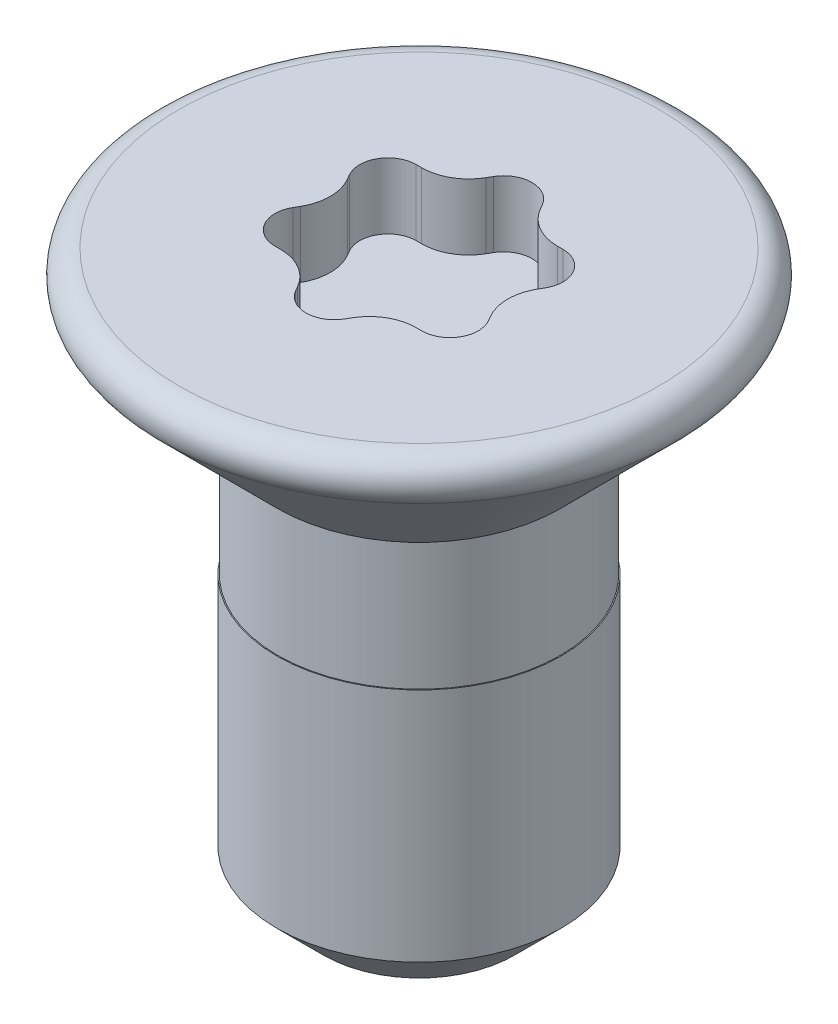
ISO-10303-21;
HEADER;
FILE_DESCRIPTION(('STEP AP214'),'2;1');
FILE_NAME('part.step','',(''),(''),'','','');
FILE_SCHEMA(('AUTOMOTIVE_DESIGN { 1 0 10303 214 1 1 1 1 }'));
ENDSEC;
DATA;
#1=APPLICATION_CONTEXT('core data for automotive mechanical design processes');
#2=APPLICATION_PROTOCOL_DEFINITION('international standard','automotive_design',2000,#1);
#3=PRODUCT_CONTEXT('',#1,'mechanical');
#4=PRODUCT('Part','Part','',(#3));
#5=PRODUCT_RELATED_PRODUCT_CATEGORY('part','',(#4));
#6=PRODUCT_DEFINITION_FORMATION('','',#4);
#7=PRODUCT_DEFINITION_CONTEXT('part definition',#1,'design');
#8=PRODUCT_DEFINITION('design','',#6,#7);
#9=PRODUCT_DEFINITION_SHAPE('','',#8);
#10=(LENGTH_UNIT() NAMED_UNIT(*) SI_UNIT(.MILLI.,.METRE.));
#11=(NAMED_UNIT(*) PLANE_ANGLE_UNIT() SI_UNIT($,.RADIAN.));
#12=(NAMED_UNIT(*) SI_UNIT($,.STERADIAN.) SOLID_ANGLE_UNIT());
#13=UNCERTAINTY_MEASURE_WITH_UNIT(LENGTH_MEASURE(1.E-05),#10,'distance_accuracy_value','');
#14=(GEOMETRIC_REPRESENTATION_CONTEXT(3) GLOBAL_UNCERTAINTY_ASSIGNED_CONTEXT((#13)) GLOBAL_UNIT_ASSIGNED_CONTEXT((#10,
#11,#12)) REPRESENTATION_CONTEXT('',''));
#15=CARTESIAN_POINT('',(0.,0.,0.));
#16=DIRECTION('',(0.,0.,1.));
#17=DIRECTION('',(1.,0.,0.));
#18=AXIS2_PLACEMENT_3D('',#15,#16,#17);
#19=CARTESIAN_POINT('',(0.,-6.,0.));
#20=DIRECTION('',(0.,-1.,0.));
#21=DIRECTION('',(1.,0.,0.));
#22=AXIS2_PLACEMENT_3D('',#19,#20,#21);
#23=PLANE('',#22);
#24=CARTESIAN_POINT('',(0.,-6.00000000008549,0.));
#25=DIRECTION('',(0.,1.,0.));
#26=DIRECTION('',(0.,0.,1.));
#27=AXIS2_PLACEMENT_3D('',#24,#25,#26);
#28=CIRCLE('',#27,1.01414213560247);
#29=CARTESIAN_POINT('',(0.,-6.00000000008549,1.01414213560247));
#30=VERTEX_POINT('',#29);
#31=EDGE_CURVE('E285',#30,#30,#28,.T.);
#32=ORIENTED_EDGE('',*,*,#31,.F.);
#33=EDGE_LOOP('',(#32));
#34=FACE_BOUND('',#33,.T.);
#35=ADVANCED_FACE('F17',(#34),#23,.T.);
#36=CARTESIAN_POINT('',(0.,-5.50414213569184,0.));
#37=DIRECTION('',(0.,1.,0.));
#38=DIRECTION('',(0.,0.,1.));
#39=AXIS2_PLACEMENT_3D('',#36,#37,#38);
#40=CONICAL_SURFACE('',#39,1.50999999999613,0.785398163397448);
#41=ORIENTED_EDGE('',*,*,#31,.T.);
#42=EDGE_LOOP('',(#41));
#43=FACE_BOUND('',#42,.T.);
#44=CARTESIAN_POINT('',(0.,-5.50414213562373,0.));
#45=DIRECTION('',(0.,1.,0.));
#46=DIRECTION('',(0.,0.,1.));
#47=AXIS2_PLACEMENT_3D('',#44,#45,#46);
#48=CIRCLE('',#47,1.51);
#49=CARTESIAN_POINT('',(0.,-5.50414213562373,1.51));
#50=VERTEX_POINT('',#49);
#51=EDGE_CURVE('E282',#50,#50,#48,.T.);
#52=ORIENTED_EDGE('',*,*,#51,.F.);
#53=EDGE_LOOP('',(#52));
#54=FACE_BOUND('',#53,.T.);
#55=ADVANCED_FACE('F747',(#43,#54),#40,.T.);
#56=CARTESIAN_POINT('',(0.,0.,0.));
#57=DIRECTION('',(0.,1.,0.));
#58=DIRECTION('',(0.,0.,1.));
#59=AXIS2_PLACEMENT_3D('',#56,#57,#58);
#60=CYLINDRICAL_SURFACE('',#59,1.51);
#61=ORIENTED_EDGE('',*,*,#51,.T.);
#62=EDGE_LOOP('',(#61));
#63=FACE_BOUND('',#62,.T.);
#64=CARTESIAN_POINT('',(0.,-3.,0.));
#65=DIRECTION('',(0.,1.,0.));
#66=DIRECTION('',(0.,0.,1.));
#67=AXIS2_PLACEMENT_3D('',#64,#65,#66);
#68=CIRCLE('',#67,1.51);
#69=CARTESIAN_POINT('',(0.,-3.,1.51));
#70=VERTEX_POINT('',#69);
#71=EDGE_CURVE('E284',#70,#70,#68,.T.);
#72=ORIENTED_EDGE('',*,*,#71,.F.);
#73=EDGE_LOOP('',(#72));
#74=FACE_BOUND('',#73,.T.);
#75=ADVANCED_FACE('F737',(#63,#74),#60,.T.);
#76=CARTESIAN_POINT('',(-1.5,-3.,0.));
#77=DIRECTION('',(0.,1.,0.));
#78=DIRECTION('',(0.,0.,1.));
#79=AXIS2_PLACEMENT_3D('',#76,#77,#78);
#80=PLANE('',#79);
#81=CARTESIAN_POINT('',(0.,-3.,0.));
#82=DIRECTION('',(0.,1.,0.));
#83=DIRECTION('',(-1.,0.,0.));
#84=AXIS2_PLACEMENT_3D('',#81,#82,#83);
#85=CIRCLE('',#84,1.5);
#86=CARTESIAN_POINT('',(-1.5,-3.,0.));
#87=VERTEX_POINT('',#86);
#88=EDGE_CURVE('E281',#87,#87,#85,.T.);
#89=ORIENTED_EDGE('',*,*,#88,.F.);
#90=EDGE_LOOP('',(#89));
#91=FACE_BOUND('',#90,.T.);
#92=ORIENTED_EDGE('',*,*,#71,.T.);
#93=EDGE_LOOP('',(#92));
#94=FACE_BOUND('',#93,.T.);
#95=ADVANCED_FACE('F727',(#91,#94),#80,.T.);
#96=CARTESIAN_POINT('',(0.,-1.65,0.));
#97=DIRECTION('',(0.,1.,0.));
#98=DIRECTION('',(-1.,0.,0.));
#99=AXIS2_PLACEMENT_3D('',#96,#97,#98);
#100=CYLINDRICAL_SURFACE('',#99,1.5);
#101=CARTESIAN_POINT('',(0.,-1.65000000004056,0.));
#102=DIRECTION('',(0.,1.,0.));
#103=DIRECTION('',(0.,0.,1.));
#104=AXIS2_PLACEMENT_3D('',#101,#102,#103);
#105=CIRCLE('',#104,1.49999999996453);
#106=CARTESIAN_POINT('',(0.,-1.65000000004056,1.49999999996453));
#107=VERTEX_POINT('',#106);
#108=EDGE_CURVE('E278',#107,#107,#105,.T.);
#109=ORIENTED_EDGE('',*,*,#108,.F.);
#110=EDGE_LOOP('',(#109));
#111=FACE_BOUND('',#110,.T.);
#112=ORIENTED_EDGE('',*,*,#88,.T.);
#113=EDGE_LOOP('',(#112));
#114=FACE_BOUND('',#113,.T.);
#115=ADVANCED_FACE('F719',(#111,#114),#100,.T.);
#116=CARTESIAN_POINT('',(0.,-0.426776695405806,0.));
#117=DIRECTION('',(0.,1.,0.));
#118=DIRECTION('',(-1.,0.,0.));
#119=AXIS2_PLACEMENT_3D('',#116,#117,#118);
#120=CONICAL_SURFACE('',#119,2.72322330459929,0.785398163397448);
#121=ORIENTED_EDGE('',*,*,#108,.T.);
#122=EDGE_LOOP('',(#121));
#123=FACE_BOUND('',#122,.T.);
#124=CARTESIAN_POINT('',(0.,-0.426776695296636,0.));
#125=DIRECTION('',(0.,-1.,0.));
#126=DIRECTION('',(0.,0.,-1.));
#127=AXIS2_PLACEMENT_3D('',#124,#125,#126);
#128=CIRCLE('',#127,2.72322330470336);
#129=CARTESIAN_POINT('',(0.,-0.426776695296636,-2.72322330470336));
#130=VERTEX_POINT('',#129);
#131=EDGE_CURVE('E240',#130,#130,#128,.F.);
#132=ORIENTED_EDGE('',*,*,#131,.F.);
#133=EDGE_LOOP('',(#132));
#134=FACE_BOUND('',#133,.T.);
#135=ADVANCED_FACE('F712',(#123,#134),#120,.T.);
#136=CARTESIAN_POINT('',(-0.721687836487033,-0.7,-1.25));
#137=DIRECTION('',(0.,1.,0.));
#138=DIRECTION('',(0.,0.,1.));
#139=AXIS2_PLACEMENT_3D('',#136,#137,#138);
#140=PLANE('',#139);
#141=CARTESIAN_POINT('',(0.,-0.7,-0.900000000000001));
#142=DIRECTION('',(0.,1.,0.));
#143=DIRECTION('',(0.,0.,1.));
#144=AXIS2_PLACEMENT_3D('',#141,#142,#143);
#145=CIRCLE('',#144,0.3);
#146=CARTESIAN_POINT('',(0.259807621135331,-0.7,-1.05));
#147=VERTEX_POINT('',#146);
#148=CARTESIAN_POINT('',(-0.259807621135332,-0.7,-1.05));
#149=VERTEX_POINT('',#148);
#150=EDGE_CURVE('E238',#147,#149,#145,.T.);
#151=ORIENTED_EDGE('',*,*,#150,.T.);
#152=DIRECTION('',(0.5,0.,-0.866025403784438));
#153=VECTOR('',#152,1.);
#154=CARTESIAN_POINT('',(-0.288675134594814,-0.7,-1.));
#155=LINE('',#154,#153);
#156=CARTESIAN_POINT('',(-0.288675134594814,-0.7,-1.));
#157=VERTEX_POINT('',#156);
#158=EDGE_CURVE('E230',#157,#149,#155,.T.);
#159=ORIENTED_EDGE('',*,*,#158,.F.);
#160=CARTESIAN_POINT('',(-0.721687836487033,-0.7,-1.25));
#161=DIRECTION('',(0.,1.,0.));
#162=DIRECTION('',(0.,0.,1.));
#163=AXIS2_PLACEMENT_3D('',#160,#161,#162);
#164=CIRCLE('',#163,0.5);
#165=CARTESIAN_POINT('',(-0.721687836487033,-0.7,-0.75));
#166=VERTEX_POINT('',#165);
#167=EDGE_CURVE('E328',#166,#157,#164,.T.);
#168=ORIENTED_EDGE('',*,*,#167,.F.);
#169=DIRECTION('',(1.,0.,0.));
#170=VECTOR('',#169,1.);
#171=CARTESIAN_POINT('',(-0.779422863405995,-0.7,-0.75));
#172=LINE('',#171,#170);
#173=CARTESIAN_POINT('',(-0.779422863405995,-0.7,-0.75));
#174=VERTEX_POINT('',#173);
#175=EDGE_CURVE('E180',#174,#166,#172,.T.);
#176=ORIENTED_EDGE('',*,*,#175,.F.);
#177=CARTESIAN_POINT('',(-0.779422863405995,-0.7,-0.45));
#178=DIRECTION('',(0.,1.,0.));
#179=DIRECTION('',(0.,0.,1.));
#180=AXIS2_PLACEMENT_3D('',#177,#178,#179);
#181=CIRCLE('',#180,0.3);
#182=CARTESIAN_POINT('',(-1.03923048454133,-0.7,-0.3));
#183=VERTEX_POINT('',#182);
#184=EDGE_CURVE('E194',#174,#183,#181,.T.);
#185=ORIENTED_EDGE('',*,*,#184,.T.);
#186=DIRECTION('',(-0.500000000000001,0.,-0.866025403784438));
#187=VECTOR('',#186,1.);
#188=CARTESIAN_POINT('',(-1.01036297108185,-0.7,-0.25));
#189=LINE('',#188,#187);
#190=CARTESIAN_POINT('',(-1.01036297108185,-0.7,-0.25));
#191=VERTEX_POINT('',#190);
#192=EDGE_CURVE('E186',#191,#183,#189,.T.);
#193=ORIENTED_EDGE('',*,*,#192,.F.);
#194=CARTESIAN_POINT('',(-1.44337567297407,-0.7,0.));
#195=DIRECTION('',(0.,1.,0.));
#196=DIRECTION('',(0.,0.,1.));
#197=AXIS2_PLACEMENT_3D('',#194,#195,#196);
#198=CIRCLE('',#197,0.5);
#199=CARTESIAN_POINT('',(-1.01036297108185,-0.7,0.249999999999999));
#200=VERTEX_POINT('',#199);
#201=EDGE_CURVE('E206',#200,#191,#198,.T.);
#202=ORIENTED_EDGE('',*,*,#201,.F.);
#203=DIRECTION('',(0.499999999999995,0.,-0.866025403784441));
#204=VECTOR('',#203,1.);
#205=CARTESIAN_POINT('',(-1.03923048454133,-0.7,0.300000000000001));
#206=LINE('',#205,#204);
#207=CARTESIAN_POINT('',(-1.03923048454133,-0.7,0.300000000000001));
#208=VERTEX_POINT('',#207);
#209=EDGE_CURVE('E273',#208,#200,#206,.T.);
#210=ORIENTED_EDGE('',*,*,#209,.F.);
#211=CARTESIAN_POINT('',(-0.779422863405996,-0.7,0.450000000000001));
#212=DIRECTION('',(0.,1.,0.));
#213=DIRECTION('',(0.,0.,1.));
#214=AXIS2_PLACEMENT_3D('',#211,#212,#213);
#215=CIRCLE('',#214,0.3);
#216=CARTESIAN_POINT('',(-0.779422863405997,-0.7,0.75));
#217=VERTEX_POINT('',#216);
#218=EDGE_CURVE('E272',#208,#217,#215,.T.);
#219=ORIENTED_EDGE('',*,*,#218,.T.);
#220=DIRECTION('',(-1.,0.,0.));
#221=VECTOR('',#220,1.);
#222=CARTESIAN_POINT('',(-0.721687836487033,-0.7,0.750000000000001));
#223=LINE('',#222,#221);
#224=CARTESIAN_POINT('',(-0.721687836487031,-0.7,0.750000000000001));
#225=VERTEX_POINT('',#224);
#226=EDGE_CURVE('E269',#225,#217,#223,.T.);
#227=ORIENTED_EDGE('',*,*,#226,.F.);
#228=CARTESIAN_POINT('',(-0.721687836487033,-0.7,1.25));
#229=DIRECTION('',(0.,1.,0.));
#230=DIRECTION('',(0.,0.,1.));
#231=AXIS2_PLACEMENT_3D('',#228,#229,#230);
#232=CIRCLE('',#231,0.5);
#233=CARTESIAN_POINT('',(-0.288675134594814,-0.7,1.));
#234=VERTEX_POINT('',#233);
#235=EDGE_CURVE('E348',#234,#225,#232,.T.);
#236=ORIENTED_EDGE('',*,*,#235,.F.);
#237=DIRECTION('',(-0.500000000000002,0.,-0.866025403784438));
#238=VECTOR('',#237,1.);
#239=CARTESIAN_POINT('',(-0.259807621135332,-0.7,1.05));
#240=LINE('',#239,#238);
#241=CARTESIAN_POINT('',(-0.259807621135331,-0.7,1.05));
#242=VERTEX_POINT('',#241);
#243=EDGE_CURVE('E265',#242,#234,#240,.T.);
#244=ORIENTED_EDGE('',*,*,#243,.F.);
#245=CARTESIAN_POINT('',(0.,-0.7,0.900000000000001));
#246=DIRECTION('',(0.,1.,0.));
#247=DIRECTION('',(0.,0.,1.));
#248=AXIS2_PLACEMENT_3D('',#245,#246,#247);
#249=CIRCLE('',#248,0.3);
#250=CARTESIAN_POINT('',(0.259807621135332,-0.7,1.05));
#251=VERTEX_POINT('',#250);
#252=EDGE_CURVE('E264',#242,#251,#249,.T.);
#253=ORIENTED_EDGE('',*,*,#252,.T.);
#254=DIRECTION('',(-0.499999999999999,0.,0.866025403784439));
#255=VECTOR('',#254,1.);
#256=CARTESIAN_POINT('',(0.288675134594813,-0.7,1.));
#257=LINE('',#256,#255);
#258=CARTESIAN_POINT('',(0.288675134594813,-0.7,1.));
#259=VERTEX_POINT('',#258);
#260=EDGE_CURVE('E261',#259,#251,#257,.T.);
#261=ORIENTED_EDGE('',*,*,#260,.F.);
#262=CARTESIAN_POINT('',(0.721687836487033,-0.7,1.25));
#263=DIRECTION('',(0.,1.,0.));
#264=DIRECTION('',(0.,0.,1.));
#265=AXIS2_PLACEMENT_3D('',#262,#263,#264);
#266=CIRCLE('',#265,0.5);
#267=CARTESIAN_POINT('',(0.721687836487032,-0.7,0.750000000000001));
#268=VERTEX_POINT('',#267);
#269=EDGE_CURVE('E343',#268,#259,#266,.T.);
#270=ORIENTED_EDGE('',*,*,#269,.F.);
#271=DIRECTION('',(-1.,0.,0.));
#272=VECTOR('',#271,1.);
#273=CARTESIAN_POINT('',(0.779422863405995,-0.7,0.750000000000001));
#274=LINE('',#273,#272);
#275=CARTESIAN_POINT('',(0.779422863405995,-0.7,0.750000000000001));
#276=VERTEX_POINT('',#275);
#277=EDGE_CURVE('E257',#276,#268,#274,.T.);
#278=ORIENTED_EDGE('',*,*,#277,.F.);
#279=CARTESIAN_POINT('',(0.779422863405995,-0.7,0.450000000000001));
#280=DIRECTION('',(0.,1.,0.));
#281=DIRECTION('',(0.,0.,1.));
#282=AXIS2_PLACEMENT_3D('',#279,#280,#281);
#283=CIRCLE('',#282,0.3);
#284=CARTESIAN_POINT('',(1.03923048454133,-0.7,0.300000000000001));
#285=VERTEX_POINT('',#284);
#286=EDGE_CURVE('E256',#276,#285,#283,.T.);
#287=ORIENTED_EDGE('',*,*,#286,.T.);
#288=DIRECTION('',(0.499999999999997,0.,0.866025403784441));
#289=VECTOR('',#288,1.);
#290=CARTESIAN_POINT('',(1.01036297108185,-0.7,0.250000000000001));
#291=LINE('',#290,#289);
#292=CARTESIAN_POINT('',(1.01036297108185,-0.7,0.25));
#293=VERTEX_POINT('',#292);
#294=EDGE_CURVE('E253',#293,#285,#291,.T.);
#295=ORIENTED_EDGE('',*,*,#294,.F.);
#296=CARTESIAN_POINT('',(1.44337567297406,-0.7,0.));
#297=DIRECTION('',(0.,1.,0.));
#298=DIRECTION('',(0.,0.,1.));
#299=AXIS2_PLACEMENT_3D('',#296,#297,#298);
#300=CIRCLE('',#299,0.5);
#301=CARTESIAN_POINT('',(1.01036297108185,-0.7,-0.25));
#302=VERTEX_POINT('',#301);
#303=EDGE_CURVE('E338',#302,#293,#300,.T.);
#304=ORIENTED_EDGE('',*,*,#303,.F.);
#305=DIRECTION('',(-0.500000000000003,0.,0.866025403784437));
#306=VECTOR('',#305,1.);
#307=CARTESIAN_POINT('',(1.03923048454133,-0.7,-0.3));
#308=LINE('',#307,#306);
#309=CARTESIAN_POINT('',(1.03923048454133,-0.7,-0.299999999999999));
#310=VERTEX_POINT('',#309);
#311=EDGE_CURVE('E249',#310,#302,#308,.T.);
#312=ORIENTED_EDGE('',*,*,#311,.F.);
#313=CARTESIAN_POINT('',(0.779422863405996,-0.7,-0.45));
#314=DIRECTION('',(0.,1.,0.));
#315=DIRECTION('',(0.,0.,1.));
#316=AXIS2_PLACEMENT_3D('',#313,#314,#315);
#317=CIRCLE('',#316,0.3);
#318=CARTESIAN_POINT('',(0.779422863405996,-0.7,-0.749999999999999));
#319=VERTEX_POINT('',#318);
#320=EDGE_CURVE('E248',#310,#319,#317,.T.);
#321=ORIENTED_EDGE('',*,*,#320,.T.);
#322=DIRECTION('',(1.,0.,0.));
#323=VECTOR('',#322,1.);
#324=CARTESIAN_POINT('',(0.721687836487033,-0.7,-0.749999999999999));
#325=LINE('',#324,#323);
#326=CARTESIAN_POINT('',(0.721687836487033,-0.7,-0.75));
#327=VERTEX_POINT('',#326);
#328=EDGE_CURVE('E245',#327,#319,#325,.T.);
#329=ORIENTED_EDGE('',*,*,#328,.F.);
#330=CARTESIAN_POINT('',(0.721687836487033,-0.7,-1.25));
#331=DIRECTION('',(0.,1.,0.));
#332=DIRECTION('',(0.,0.,1.));
#333=AXIS2_PLACEMENT_3D('',#330,#331,#332);
#334=CIRCLE('',#333,0.5);
#335=CARTESIAN_POINT('',(0.288675134594814,-0.7,-0.999999999999999));
#336=VERTEX_POINT('',#335);
#337=EDGE_CURVE('E333',#336,#327,#334,.T.);
#338=ORIENTED_EDGE('',*,*,#337,.F.);
#339=DIRECTION('',(0.500000000000004,0.,0.866025403784436));
#340=VECTOR('',#339,1.);
#341=CARTESIAN_POINT('',(0.259807621135331,-0.7,-1.05));
#342=LINE('',#341,#340);
#343=EDGE_CURVE('E241',#147,#336,#342,.T.);
#344=ORIENTED_EDGE('',*,*,#343,.F.);
#345=EDGE_LOOP('',(#151,#159,#168,#176,#185,#193,#202,#210,#219,#227,#236,#244,#253,#261,#270,
#278,#287,#295,#304,#312,#321,#329,#338,#344));
#346=FACE_BOUND('',#345,.T.);
#347=ADVANCED_FACE('F197',(#346),#140,.T.);
#348=CARTESIAN_POINT('',(0.,-0.25,0.));
#349=DIRECTION('',(0.,-1.,0.));
#350=DIRECTION('',(0.,0.,-1.));
#351=AXIS2_PLACEMENT_3D('',#348,#349,#350);
#352=TOROIDAL_SURFACE('',#351,2.54644660940672,0.25);
#353=CARTESIAN_POINT('',(0.,0.,0.));
#354=DIRECTION('',(0.,-1.,0.));
#355=DIRECTION('',(0.,0.,-1.));
#356=AXIS2_PLACEMENT_3D('',#353,#354,#355);
#357=CIRCLE('',#356,2.54644660940672);
#358=CARTESIAN_POINT('',(0.,0.,-2.54644660940672));
#359=VERTEX_POINT('',#358);
#360=CARTESIAN_POINT('',(0.,0.,2.54644660940672));
#361=VERTEX_POINT('',#360);
#362=EDGE_CURVE('E360',#359,#361,#357,.T.);
#363=ORIENTED_EDGE('',*,*,#362,.T.);
#364=CARTESIAN_POINT('',(0.,0.,0.));
#365=DIRECTION('',(0.,-1.,0.));
#366=DIRECTION('',(0.,0.,1.));
#367=AXIS2_PLACEMENT_3D('',#364,#365,#366);
#368=CIRCLE('',#367,2.54644660940672);
#369=EDGE_CURVE('E363',#361,#359,#368,.T.);
#370=ORIENTED_EDGE('',*,*,#369,.T.);
#371=EDGE_LOOP('',(#363,#370));
#372=FACE_BOUND('',#371,.T.);
#373=ORIENTED_EDGE('',*,*,#131,.T.);
#374=EDGE_LOOP('',(#373));
#375=FACE_BOUND('',#374,.T.);
#376=ADVANCED_FACE('F217',(#372,#375),#352,.T.);
#377=CARTESIAN_POINT('',(-0.779422863405995,-0.7,-0.75));
#378=DIRECTION('',(0.,0.,1.));
#379=DIRECTION('',(1.,0.,0.));
#380=AXIS2_PLACEMENT_3D('',#377,#378,#379);
#381=PLANE('',#380);
#382=ORIENTED_EDGE('',*,*,#175,.T.);
#383=DIRECTION('',(0.,1.,0.));
#384=VECTOR('',#383,1.);
#385=CARTESIAN_POINT('',(-0.721687836487033,-0.7,-0.75));
#386=LINE('',#385,#384);
#387=CARTESIAN_POINT('',(-0.721687836487033,0.,-0.75));
#388=VERTEX_POINT('',#387);
#389=EDGE_CURVE('E330',#388,#166,#386,.F.);
#390=ORIENTED_EDGE('',*,*,#389,.F.);
#391=DIRECTION('',(1.,0.,0.));
#392=VECTOR('',#391,1.);
#393=CARTESIAN_POINT('',(0.,0.,-0.75));
#394=LINE('',#393,#392);
#395=CARTESIAN_POINT('',(-0.779422863405995,0.,-0.75));
#396=VERTEX_POINT('',#395);
#397=EDGE_CURVE('E327',#388,#396,#394,.F.);
#398=ORIENTED_EDGE('',*,*,#397,.T.);
#399=DIRECTION('',(0.,1.,0.));
#400=VECTOR('',#399,1.);
#401=CARTESIAN_POINT('',(-0.779422863405995,-0.7,-0.75));
#402=LINE('',#401,#400);
#403=EDGE_CURVE('E200',#396,#174,#402,.F.);
#404=ORIENTED_EDGE('',*,*,#403,.T.);
#405=EDGE_LOOP('',(#382,#390,#398,#404));
#406=FACE_BOUND('',#405,.T.);
#407=ADVANCED_FACE('F222',(#406),#381,.T.);
#408=CARTESIAN_POINT('',(-0.779422863405995,-0.7,-0.45));
#409=DIRECTION('',(0.,1.,0.));
#410=DIRECTION('',(0.,0.,1.));
#411=AXIS2_PLACEMENT_3D('',#408,#409,#410);
#412=CYLINDRICAL_SURFACE('',#411,0.3);
#413=DIRECTION('',(0.,1.,0.));
#414=VECTOR('',#413,1.);
#415=CARTESIAN_POINT('',(-1.03923048454133,-0.7,-0.3));
#416=LINE('',#415,#414);
#417=CARTESIAN_POINT('',(-1.03923048454133,0.,-0.3));
#418=VERTEX_POINT('',#417);
#419=EDGE_CURVE('E190',#183,#418,#416,.T.);
#420=ORIENTED_EDGE('',*,*,#419,.F.);
#421=ORIENTED_EDGE('',*,*,#184,.F.);
#422=ORIENTED_EDGE('',*,*,#403,.F.);
#423=CARTESIAN_POINT('',(-0.779422863405995,0.,-0.45));
#424=DIRECTION('',(0.,1.,0.));
#425=DIRECTION('',(0.,0.,1.));
#426=AXIS2_PLACEMENT_3D('',#423,#424,#425);
#427=CIRCLE('',#426,0.3);
#428=EDGE_CURVE('E205',#396,#418,#427,.T.);
#429=ORIENTED_EDGE('',*,*,#428,.T.);
#430=EDGE_LOOP('',(#420,#421,#422,#429));
#431=FACE_BOUND('',#430,.T.);
#432=ADVANCED_FACE('F203',(#431),#412,.F.);
#433=CARTESIAN_POINT('',(-1.01036297108185,-0.7,-0.25));
#434=DIRECTION('',(0.866025403784438,0.,-0.500000000000001));
#435=DIRECTION('',(-0.500000000000001,0.,-0.866025403784438));
#436=AXIS2_PLACEMENT_3D('',#433,#434,#435);
#437=PLANE('',#436);
#438=ORIENTED_EDGE('',*,*,#192,.T.);
#439=ORIENTED_EDGE('',*,*,#419,.T.);
#440=DIRECTION('',(0.499999999999999,0.,0.866025403784439));
#441=VECTOR('',#440,1.);
#442=CARTESIAN_POINT('',(-1.03923048454133,0.,-0.3));
#443=LINE('',#442,#441);
#444=CARTESIAN_POINT('',(-1.01036297108185,0.,-0.249999999999999));
#445=VERTEX_POINT('',#444);
#446=EDGE_CURVE('E325',#418,#445,#443,.T.);
#447=ORIENTED_EDGE('',*,*,#446,.T.);
#448=DIRECTION('',(0.,1.,0.));
#449=VECTOR('',#448,1.);
#450=CARTESIAN_POINT('',(-1.01036297108185,-0.7,-0.25));
#451=LINE('',#450,#449);
#452=EDGE_CURVE('E192',#191,#445,#451,.T.);
#453=ORIENTED_EDGE('',*,*,#452,.F.);
#454=EDGE_LOOP('',(#438,#439,#447,#453));
#455=FACE_BOUND('',#454,.T.);
#456=ADVANCED_FACE('F187',(#455),#437,.T.);
#457=CARTESIAN_POINT('',(-1.44337567297407,-0.7,0.));
#458=DIRECTION('',(0.,1.,0.));
#459=DIRECTION('',(0.,0.,1.));
#460=AXIS2_PLACEMENT_3D('',#457,#458,#459);
#461=CYLINDRICAL_SURFACE('',#460,0.5);
#462=ORIENTED_EDGE('',*,*,#201,.T.);
#463=ORIENTED_EDGE('',*,*,#452,.T.);
#464=CARTESIAN_POINT('',(-1.44337567297407,0.,0.));
#465=DIRECTION('',(0.,1.,0.));
#466=DIRECTION('',(0.,0.,1.));
#467=AXIS2_PLACEMENT_3D('',#464,#465,#466);
#468=CIRCLE('',#467,0.5);
#469=CARTESIAN_POINT('',(-1.01036297108185,0.,0.249999999999999));
#470=VERTEX_POINT('',#469);
#471=EDGE_CURVE('E322',#445,#470,#468,.F.);
#472=ORIENTED_EDGE('',*,*,#471,.T.);
#473=DIRECTION('',(0.,1.,0.));
#474=VECTOR('',#473,1.);
#475=CARTESIAN_POINT('',(-1.01036297108185,-0.7,0.25));
#476=LINE('',#475,#474);
#477=EDGE_CURVE('E274',#200,#470,#476,.T.);
#478=ORIENTED_EDGE('',*,*,#477,.F.);
#479=EDGE_LOOP('',(#462,#463,#472,#478));
#480=FACE_BOUND('',#479,.T.);
#481=ADVANCED_FACE('F408',(#480),#461,.T.);
#482=CARTESIAN_POINT('',(-1.03923048454133,-0.7,0.300000000000001));
#483=DIRECTION('',(0.866025403784441,0.,0.499999999999995));
#484=DIRECTION('',(0.499999999999995,0.,-0.866025403784441));
#485=AXIS2_PLACEMENT_3D('',#482,#483,#484);
#486=PLANE('',#485);
#487=ORIENTED_EDGE('',*,*,#209,.T.);
#488=ORIENTED_EDGE('',*,*,#477,.T.);
#489=DIRECTION('',(-0.499999999999995,0.,0.866025403784441));
#490=VECTOR('',#489,1.);
#491=CARTESIAN_POINT('',(-1.01036297108185,0.,0.25));
#492=LINE('',#491,#490);
#493=CARTESIAN_POINT('',(-1.03923048454133,0.,0.300000000000001));
#494=VERTEX_POINT('',#493);
#495=EDGE_CURVE('E321',#470,#494,#492,.T.);
#496=ORIENTED_EDGE('',*,*,#495,.T.);
#497=DIRECTION('',(0.,1.,0.));
#498=VECTOR('',#497,1.);
#499=CARTESIAN_POINT('',(-1.03923048454133,-0.7,0.300000000000001));
#500=LINE('',#499,#498);
#501=EDGE_CURVE('E351',#494,#208,#500,.F.);
#502=ORIENTED_EDGE('',*,*,#501,.T.);
#503=EDGE_LOOP('',(#487,#488,#496,#502));
#504=FACE_BOUND('',#503,.T.);
#505=ADVANCED_FACE('F399',(#504),#486,.T.);
#506=CARTESIAN_POINT('',(-0.779422863405996,-0.7,0.450000000000001));
#507=DIRECTION('',(0.,1.,0.));
#508=DIRECTION('',(0.,0.,1.));
#509=AXIS2_PLACEMENT_3D('',#506,#507,#508);
#510=CYLINDRICAL_SURFACE('',#509,0.3);
#511=DIRECTION('',(0.,1.,0.));
#512=VECTOR('',#511,1.);
#513=CARTESIAN_POINT('',(-0.779422863405996,-0.7,0.75));
#514=LINE('',#513,#512);
#515=CARTESIAN_POINT('',(-0.779422863405996,0.,0.75));
#516=VERTEX_POINT('',#515);
#517=EDGE_CURVE('E271',#217,#516,#514,.T.);
#518=ORIENTED_EDGE('',*,*,#517,.F.);
#519=ORIENTED_EDGE('',*,*,#218,.F.);
#520=ORIENTED_EDGE('',*,*,#501,.F.);
#521=CARTESIAN_POINT('',(-0.779422863405996,0.,0.450000000000001));
#522=DIRECTION('',(0.,1.,0.));
#523=DIRECTION('',(0.,0.,1.));
#524=AXIS2_PLACEMENT_3D('',#521,#522,#523);
#525=CIRCLE('',#524,0.3);
#526=EDGE_CURVE('E318',#494,#516,#525,.T.);
#527=ORIENTED_EDGE('',*,*,#526,.T.);
#528=EDGE_LOOP('',(#518,#519,#520,#527));
#529=FACE_BOUND('',#528,.T.);
#530=ADVANCED_FACE('F413',(#529),#510,.F.);
#531=CARTESIAN_POINT('',(-0.721687836487033,-0.7,0.750000000000001));
#532=DIRECTION('',(0.,0.,-1.));
#533=DIRECTION('',(-1.,0.,0.));
#534=AXIS2_PLACEMENT_3D('',#531,#532,#533);
#535=PLANE('',#534);
#536=ORIENTED_EDGE('',*,*,#226,.T.);
#537=ORIENTED_EDGE('',*,*,#517,.T.);
#538=DIRECTION('',(1.,0.,0.));
#539=VECTOR('',#538,1.);
#540=CARTESIAN_POINT('',(0.,0.,0.75));
#541=LINE('',#540,#539);
#542=CARTESIAN_POINT('',(-0.721687836487033,0.,0.75));
#543=VERTEX_POINT('',#542);
#544=EDGE_CURVE('E317',#516,#543,#541,.T.);
#545=ORIENTED_EDGE('',*,*,#544,.T.);
#546=DIRECTION('',(0.,1.,0.));
#547=VECTOR('',#546,1.);
#548=CARTESIAN_POINT('',(-0.721687836487033,-0.7,0.750000000000001));
#549=LINE('',#548,#547);
#550=EDGE_CURVE('E268',#225,#543,#549,.T.);
#551=ORIENTED_EDGE('',*,*,#550,.F.);
#552=EDGE_LOOP('',(#536,#537,#545,#551));
#553=FACE_BOUND('',#552,.T.);
#554=ADVANCED_FACE('F416',(#553),#535,.T.);
#555=CARTESIAN_POINT('',(-0.721687836487033,-0.7,1.25));
#556=DIRECTION('',(0.,1.,0.));
#557=DIRECTION('',(0.,0.,1.));
#558=AXIS2_PLACEMENT_3D('',#555,#556,#557);
#559=CYLINDRICAL_SURFACE('',#558,0.5);
#560=ORIENTED_EDGE('',*,*,#235,.T.);
#561=ORIENTED_EDGE('',*,*,#550,.T.);
#562=CARTESIAN_POINT('',(-0.721687836487033,0.,1.25));
#563=DIRECTION('',(0.,1.,0.));
#564=DIRECTION('',(0.,0.,1.));
#565=AXIS2_PLACEMENT_3D('',#562,#563,#564);
#566=CIRCLE('',#565,0.5);
#567=CARTESIAN_POINT('',(-0.288675134594814,0.,1.));
#568=VERTEX_POINT('',#567);
#569=EDGE_CURVE('E314',#543,#568,#566,.F.);
#570=ORIENTED_EDGE('',*,*,#569,.T.);
#571=DIRECTION('',(0.,1.,0.));
#572=VECTOR('',#571,1.);
#573=CARTESIAN_POINT('',(-0.288675134594813,-0.7,1.));
#574=LINE('',#573,#572);
#575=EDGE_CURVE('E267',#234,#568,#574,.T.);
#576=ORIENTED_EDGE('',*,*,#575,.F.);
#577=EDGE_LOOP('',(#560,#561,#570,#576));
#578=FACE_BOUND('',#577,.T.);
#579=ADVANCED_FACE('F472',(#578),#559,.T.);
#580=CARTESIAN_POINT('',(-0.259807621135332,-0.7,1.05));
#581=DIRECTION('',(0.866025403784438,0.,-0.500000000000002));
#582=DIRECTION('',(-0.500000000000002,0.,-0.866025403784438));
#583=AXIS2_PLACEMENT_3D('',#580,#581,#582);
#584=PLANE('',#583);
#585=ORIENTED_EDGE('',*,*,#243,.T.);
#586=ORIENTED_EDGE('',*,*,#575,.T.);
#587=DIRECTION('',(0.500000000000002,0.,0.866025403784438));
#588=VECTOR('',#587,1.);
#589=CARTESIAN_POINT('',(-0.288675134594813,0.,1.));
#590=LINE('',#589,#588);
#591=CARTESIAN_POINT('',(-0.259807621135331,0.,1.05));
#592=VERTEX_POINT('',#591);
#593=EDGE_CURVE('E313',#568,#592,#590,.T.);
#594=ORIENTED_EDGE('',*,*,#593,.T.);
#595=DIRECTION('',(0.,1.,0.));
#596=VECTOR('',#595,1.);
#597=CARTESIAN_POINT('',(-0.259807621135332,-0.7,1.05));
#598=LINE('',#597,#596);
#599=EDGE_CURVE('E347',#592,#242,#598,.F.);
#600=ORIENTED_EDGE('',*,*,#599,.T.);
#601=EDGE_LOOP('',(#585,#586,#594,#600));
#602=FACE_BOUND('',#601,.T.);
#603=ADVANCED_FACE('F469',(#602),#584,.T.);
#604=CARTESIAN_POINT('',(0.,-0.7,0.900000000000001));
#605=DIRECTION('',(0.,1.,0.));
#606=DIRECTION('',(0.,0.,1.));
#607=AXIS2_PLACEMENT_3D('',#604,#605,#606);
#608=CYLINDRICAL_SURFACE('',#607,0.3);
#609=ORIENTED_EDGE('',*,*,#252,.F.);
#610=ORIENTED_EDGE('',*,*,#599,.F.);
#611=CARTESIAN_POINT('',(0.,0.,0.900000000000001));
#612=DIRECTION('',(0.,1.,0.));
#613=DIRECTION('',(0.,0.,1.));
#614=AXIS2_PLACEMENT_3D('',#611,#612,#613);
#615=CIRCLE('',#614,0.3);
#616=CARTESIAN_POINT('',(0.259807621135332,0.,1.05));
#617=VERTEX_POINT('',#616);
#618=EDGE_CURVE('E311',#592,#617,#615,.T.);
#619=ORIENTED_EDGE('',*,*,#618,.T.);
#620=DIRECTION('',(0.,1.,0.));
#621=VECTOR('',#620,1.);
#622=CARTESIAN_POINT('',(0.259807621135332,-0.7,1.05));
#623=LINE('',#622,#621);
#624=EDGE_CURVE('E263',#251,#617,#623,.T.);
#625=ORIENTED_EDGE('',*,*,#624,.F.);
#626=EDGE_LOOP('',(#609,#610,#619,#625));
#627=FACE_BOUND('',#626,.T.);
#628=ADVANCED_FACE('F467',(#627),#608,.F.);
#629=CARTESIAN_POINT('',(0.288675134594813,-0.7,1.));
#630=DIRECTION('',(-0.866025403784439,0.,-0.499999999999999));
#631=DIRECTION('',(-0.499999999999999,0.,0.866025403784439));
#632=AXIS2_PLACEMENT_3D('',#629,#630,#631);
#633=PLANE('',#632);
#634=ORIENTED_EDGE('',*,*,#260,.T.);
#635=ORIENTED_EDGE('',*,*,#624,.T.);
#636=DIRECTION('',(0.499999999999997,0.,-0.86602540378444));
#637=VECTOR('',#636,1.);
#638=CARTESIAN_POINT('',(0.259807621135332,0.,1.05));
#639=LINE('',#638,#637);
#640=CARTESIAN_POINT('',(0.288675134594813,0.,1.));
#641=VERTEX_POINT('',#640);
#642=EDGE_CURVE('E310',#617,#641,#639,.T.);
#643=ORIENTED_EDGE('',*,*,#642,.T.);
#644=DIRECTION('',(0.,1.,0.));
#645=VECTOR('',#644,1.);
#646=CARTESIAN_POINT('',(0.288675134594814,-0.7,1.));
#647=LINE('',#646,#645);
#648=EDGE_CURVE('E260',#259,#641,#647,.T.);
#649=ORIENTED_EDGE('',*,*,#648,.F.);
#650=EDGE_LOOP('',(#634,#635,#643,#649));
#651=FACE_BOUND('',#650,.T.);
#652=ADVANCED_FACE('F452',(#651),#633,.T.);
#653=CARTESIAN_POINT('',(0.721687836487033,-0.7,1.25));
#654=DIRECTION('',(0.,1.,0.));
#655=DIRECTION('',(0.,0.,1.));
#656=AXIS2_PLACEMENT_3D('',#653,#654,#655);
#657=CYLINDRICAL_SURFACE('',#656,0.5);
#658=ORIENTED_EDGE('',*,*,#269,.T.);
#659=ORIENTED_EDGE('',*,*,#648,.T.);
#660=CARTESIAN_POINT('',(0.721687836487033,0.,1.25));
#661=DIRECTION('',(0.,1.,0.));
#662=DIRECTION('',(0.,0.,1.));
#663=AXIS2_PLACEMENT_3D('',#660,#661,#662);
#664=CIRCLE('',#663,0.5);
#665=CARTESIAN_POINT('',(0.721687836487033,0.,0.750000000000001));
#666=VERTEX_POINT('',#665);
#667=EDGE_CURVE('E307',#641,#666,#664,.F.);
#668=ORIENTED_EDGE('',*,*,#667,.T.);
#669=DIRECTION('',(0.,1.,0.));
#670=VECTOR('',#669,1.);
#671=CARTESIAN_POINT('',(0.721687836487033,-0.7,0.750000000000001));
#672=LINE('',#671,#670);
#673=EDGE_CURVE('E259',#268,#666,#672,.T.);
#674=ORIENTED_EDGE('',*,*,#673,.F.);
#675=EDGE_LOOP('',(#658,#659,#668,#674));
#676=FACE_BOUND('',#675,.T.);
#677=ADVANCED_FACE('F461',(#676),#657,.T.);
#678=CARTESIAN_POINT('',(0.779422863405995,-0.7,0.750000000000001));
#679=DIRECTION('',(0.,0.,-1.));
#680=DIRECTION('',(-1.,0.,0.));
#681=AXIS2_PLACEMENT_3D('',#678,#679,#680);
#682=PLANE('',#681);
#683=ORIENTED_EDGE('',*,*,#277,.T.);
#684=ORIENTED_EDGE('',*,*,#673,.T.);
#685=DIRECTION('',(1.,0.,0.));
#686=VECTOR('',#685,1.);
#687=CARTESIAN_POINT('',(0.,0.,0.750000000000001));
#688=LINE('',#687,#686);
#689=CARTESIAN_POINT('',(0.779422863405995,0.,0.750000000000001));
#690=VERTEX_POINT('',#689);
#691=EDGE_CURVE('E306',#666,#690,#688,.T.);
#692=ORIENTED_EDGE('',*,*,#691,.T.);
#693=DIRECTION('',(0.,1.,0.));
#694=VECTOR('',#693,1.);
#695=CARTESIAN_POINT('',(0.779422863405995,-0.7,0.750000000000001));
#696=LINE('',#695,#694);
#697=EDGE_CURVE('E342',#690,#276,#696,.F.);
#698=ORIENTED_EDGE('',*,*,#697,.T.);
#699=EDGE_LOOP('',(#683,#684,#692,#698));
#700=FACE_BOUND('',#699,.T.);
#701=ADVANCED_FACE('F535',(#700),#682,.T.);
#702=CARTESIAN_POINT('',(0.779422863405995,-0.7,0.450000000000001));
#703=DIRECTION('',(0.,1.,0.));
#704=DIRECTION('',(0.,0.,1.));
#705=AXIS2_PLACEMENT_3D('',#702,#703,#704);
#706=CYLINDRICAL_SURFACE('',#705,0.3);
#707=DIRECTION('',(0.,1.,0.));
#708=VECTOR('',#707,1.);
#709=CARTESIAN_POINT('',(1.03923048454133,-0.7,0.300000000000001));
#710=LINE('',#709,#708);
#711=CARTESIAN_POINT('',(1.03923048454133,0.,0.300000000000001));
#712=VERTEX_POINT('',#711);
#713=EDGE_CURVE('E255',#285,#712,#710,.T.);
#714=ORIENTED_EDGE('',*,*,#713,.F.);
#715=ORIENTED_EDGE('',*,*,#286,.F.);
#716=ORIENTED_EDGE('',*,*,#697,.F.);
#717=CARTESIAN_POINT('',(0.779422863405995,0.,0.450000000000001));
#718=DIRECTION('',(0.,1.,0.));
#719=DIRECTION('',(0.,0.,1.));
#720=AXIS2_PLACEMENT_3D('',#717,#718,#719);
#721=CIRCLE('',#720,0.3);
#722=EDGE_CURVE('E303',#690,#712,#721,.T.);
#723=ORIENTED_EDGE('',*,*,#722,.T.);
#724=EDGE_LOOP('',(#714,#715,#716,#723));
#725=FACE_BOUND('',#724,.T.);
#726=ADVANCED_FACE('F531',(#725),#706,.F.);
#727=CARTESIAN_POINT('',(1.01036297108185,-0.7,0.250000000000001));
#728=DIRECTION('',(-0.866025403784441,0.,0.499999999999997));
#729=DIRECTION('',(0.499999999999997,0.,0.866025403784441));
#730=AXIS2_PLACEMENT_3D('',#727,#728,#729);
#731=PLANE('',#730);
#732=ORIENTED_EDGE('',*,*,#294,.T.);
#733=ORIENTED_EDGE('',*,*,#713,.T.);
#734=DIRECTION('',(-0.499999999999996,0.,-0.866025403784441));
#735=VECTOR('',#734,1.);
#736=CARTESIAN_POINT('',(1.03923048454133,0.,0.300000000000001));
#737=LINE('',#736,#735);
#738=CARTESIAN_POINT('',(1.01036297108185,0.,0.249999999999999));
#739=VERTEX_POINT('',#738);
#740=EDGE_CURVE('E302',#712,#739,#737,.T.);
#741=ORIENTED_EDGE('',*,*,#740,.T.);
#742=DIRECTION('',(0.,1.,0.));
#743=VECTOR('',#742,1.);
#744=CARTESIAN_POINT('',(1.01036297108185,-0.7,0.25));
#745=LINE('',#744,#743);
#746=EDGE_CURVE('E252',#293,#739,#745,.T.);
#747=ORIENTED_EDGE('',*,*,#746,.F.);
#748=EDGE_LOOP('',(#732,#733,#741,#747));
#749=FACE_BOUND('',#748,.T.);
#750=ADVANCED_FACE('F527',(#749),#731,.T.);
#751=CARTESIAN_POINT('',(1.44337567297406,-0.7,0.));
#752=DIRECTION('',(0.,1.,0.));
#753=DIRECTION('',(0.,0.,1.));
#754=AXIS2_PLACEMENT_3D('',#751,#752,#753);
#755=CYLINDRICAL_SURFACE('',#754,0.5);
#756=ORIENTED_EDGE('',*,*,#303,.T.);
#757=ORIENTED_EDGE('',*,*,#746,.T.);
#758=CARTESIAN_POINT('',(1.44337567297406,0.,0.));
#759=DIRECTION('',(0.,1.,0.));
#760=DIRECTION('',(0.,0.,1.));
#761=AXIS2_PLACEMENT_3D('',#758,#759,#760);
#762=CIRCLE('',#761,0.5);
#763=CARTESIAN_POINT('',(1.01036297108185,0.,-0.249999999999999));
#764=VERTEX_POINT('',#763);
#765=EDGE_CURVE('E299',#739,#764,#762,.F.);
#766=ORIENTED_EDGE('',*,*,#765,.T.);
#767=DIRECTION('',(0.,1.,0.));
#768=VECTOR('',#767,1.);
#769=CARTESIAN_POINT('',(1.01036297108185,-0.7,-0.249999999999999));
#770=LINE('',#769,#768);
#771=EDGE_CURVE('E251',#302,#764,#770,.T.);
#772=ORIENTED_EDGE('',*,*,#771,.F.);
#773=EDGE_LOOP('',(#756,#757,#766,#772));
#774=FACE_BOUND('',#773,.T.);
#775=ADVANCED_FACE('F523',(#774),#755,.T.);
#776=CARTESIAN_POINT('',(1.03923048454133,-0.7,-0.3));
#777=DIRECTION('',(-0.866025403784437,0.,-0.500000000000003));
#778=DIRECTION('',(-0.500000000000003,0.,0.866025403784437));
#779=AXIS2_PLACEMENT_3D('',#776,#777,#778);
#780=PLANE('',#779);
#781=ORIENTED_EDGE('',*,*,#311,.T.);
#782=ORIENTED_EDGE('',*,*,#771,.T.);
#783=DIRECTION('',(0.499999999999997,0.,-0.866025403784441));
#784=VECTOR('',#783,1.);
#785=CARTESIAN_POINT('',(1.01036297108185,0.,-0.249999999999999));
#786=LINE('',#785,#784);
#787=CARTESIAN_POINT('',(1.03923048454133,0.,-0.3));
#788=VERTEX_POINT('',#787);
#789=EDGE_CURVE('E298',#764,#788,#786,.T.);
#790=ORIENTED_EDGE('',*,*,#789,.T.);
#791=DIRECTION('',(0.,1.,0.));
#792=VECTOR('',#791,1.);
#793=CARTESIAN_POINT('',(1.03923048454133,-0.7,-0.3));
#794=LINE('',#793,#792);
#795=EDGE_CURVE('E337',#788,#310,#794,.F.);
#796=ORIENTED_EDGE('',*,*,#795,.T.);
#797=EDGE_LOOP('',(#781,#782,#790,#796));
#798=FACE_BOUND('',#797,.T.);
#799=ADVANCED_FACE('F519',(#798),#780,.T.);
#800=CARTESIAN_POINT('',(0.779422863405996,-0.7,-0.45));
#801=DIRECTION('',(0.,1.,0.));
#802=DIRECTION('',(0.,0.,1.));
#803=AXIS2_PLACEMENT_3D('',#800,#801,#802);
#804=CYLINDRICAL_SURFACE('',#803,0.3);
#805=DIRECTION('',(0.,1.,0.));
#806=VECTOR('',#805,1.);
#807=CARTESIAN_POINT('',(0.779422863405996,-0.7,-0.749999999999999));
#808=LINE('',#807,#806);
#809=CARTESIAN_POINT('',(0.779422863405996,0.,-0.75));
#810=VERTEX_POINT('',#809);
#811=EDGE_CURVE('E247',#319,#810,#808,.T.);
#812=ORIENTED_EDGE('',*,*,#811,.F.);
#813=ORIENTED_EDGE('',*,*,#320,.F.);
#814=ORIENTED_EDGE('',*,*,#795,.F.);
#815=CARTESIAN_POINT('',(0.779422863405996,0.,-0.45));
#816=DIRECTION('',(0.,1.,0.));
#817=DIRECTION('',(0.,0.,1.));
#818=AXIS2_PLACEMENT_3D('',#815,#816,#817);
#819=CIRCLE('',#818,0.3);
#820=EDGE_CURVE('E295',#788,#810,#819,.T.);
#821=ORIENTED_EDGE('',*,*,#820,.T.);
#822=EDGE_LOOP('',(#812,#813,#814,#821));
#823=FACE_BOUND('',#822,.T.);
#824=ADVANCED_FACE('F515',(#823),#804,.F.);
#825=CARTESIAN_POINT('',(0.721687836487033,-0.7,-0.749999999999999));
#826=DIRECTION('',(0.,0.,1.));
#827=DIRECTION('',(1.,0.,0.));
#828=AXIS2_PLACEMENT_3D('',#825,#826,#827);
#829=PLANE('',#828);
#830=ORIENTED_EDGE('',*,*,#328,.T.);
#831=ORIENTED_EDGE('',*,*,#811,.T.);
#832=DIRECTION('',(1.,0.,0.));
#833=VECTOR('',#832,1.);
#834=CARTESIAN_POINT('',(0.,0.,-0.75));
#835=LINE('',#834,#833);
#836=CARTESIAN_POINT('',(0.721687836487033,0.,-0.75));
#837=VERTEX_POINT('',#836);
#838=EDGE_CURVE('E294',#810,#837,#835,.F.);
#839=ORIENTED_EDGE('',*,*,#838,.T.);
#840=DIRECTION('',(0.,1.,0.));
#841=VECTOR('',#840,1.);
#842=CARTESIAN_POINT('',(0.721687836487033,-0.7,-0.75));
#843=LINE('',#842,#841);
#844=EDGE_CURVE('E244',#327,#837,#843,.T.);
#845=ORIENTED_EDGE('',*,*,#844,.F.);
#846=EDGE_LOOP('',(#830,#831,#839,#845));
#847=FACE_BOUND('',#846,.T.);
#848=ADVANCED_FACE('F511',(#847),#829,.T.);
#849=CARTESIAN_POINT('',(0.721687836487033,-0.7,-1.25));
#850=DIRECTION('',(0.,1.,0.));
#851=DIRECTION('',(0.,0.,1.));
#852=AXIS2_PLACEMENT_3D('',#849,#850,#851);
#853=CYLINDRICAL_SURFACE('',#852,0.5);
#854=ORIENTED_EDGE('',*,*,#337,.T.);
#855=ORIENTED_EDGE('',*,*,#844,.T.);
#856=CARTESIAN_POINT('',(0.721687836487033,0.,-1.25));
#857=DIRECTION('',(0.,1.,0.));
#858=DIRECTION('',(0.,0.,1.));
#859=AXIS2_PLACEMENT_3D('',#856,#857,#858);
#860=CIRCLE('',#859,0.5);
#861=CARTESIAN_POINT('',(0.288675134594814,0.,-0.999999999999999));
#862=VERTEX_POINT('',#861);
#863=EDGE_CURVE('E291',#837,#862,#860,.F.);
#864=ORIENTED_EDGE('',*,*,#863,.T.);
#865=DIRECTION('',(0.,1.,0.));
#866=VECTOR('',#865,1.);
#867=CARTESIAN_POINT('',(0.288675134594813,-0.7,-1.));
#868=LINE('',#867,#866);
#869=EDGE_CURVE('E243',#336,#862,#868,.T.);
#870=ORIENTED_EDGE('',*,*,#869,.F.);
#871=EDGE_LOOP('',(#854,#855,#864,#870));
#872=FACE_BOUND('',#871,.T.);
#873=ADVANCED_FACE('F507',(#872),#853,.T.);
#874=CARTESIAN_POINT('',(0.259807621135331,-0.7,-1.05));
#875=DIRECTION('',(-0.866025403784436,0.,0.500000000000004));
#876=DIRECTION('',(0.500000000000004,0.,0.866025403784436));
#877=AXIS2_PLACEMENT_3D('',#874,#875,#876);
#878=PLANE('',#877);
#879=ORIENTED_EDGE('',*,*,#343,.T.);
#880=ORIENTED_EDGE('',*,*,#869,.T.);
#881=DIRECTION('',(-0.500000000000003,0.,-0.866025403784437));
#882=VECTOR('',#881,1.);
#883=CARTESIAN_POINT('',(0.288675134594813,0.,-1.));
#884=LINE('',#883,#882);
#885=CARTESIAN_POINT('',(0.259807621135331,0.,-1.05));
#886=VERTEX_POINT('',#885);
#887=EDGE_CURVE('E290',#862,#886,#884,.T.);
#888=ORIENTED_EDGE('',*,*,#887,.T.);
#889=DIRECTION('',(0.,1.,0.));
#890=VECTOR('',#889,1.);
#891=CARTESIAN_POINT('',(0.259807621135331,-0.7,-1.05));
#892=LINE('',#891,#890);
#893=EDGE_CURVE('E332',#886,#147,#892,.F.);
#894=ORIENTED_EDGE('',*,*,#893,.T.);
#895=EDGE_LOOP('',(#879,#880,#888,#894));
#896=FACE_BOUND('',#895,.T.);
#897=ADVANCED_FACE('F503',(#896),#878,.T.);
#898=CARTESIAN_POINT('',(0.,-0.7,-0.900000000000001));
#899=DIRECTION('',(0.,1.,0.));
#900=DIRECTION('',(0.,0.,1.));
#901=AXIS2_PLACEMENT_3D('',#898,#899,#900);
#902=CYLINDRICAL_SURFACE('',#901,0.3);
#903=DIRECTION('',(0.,1.,0.));
#904=VECTOR('',#903,1.);
#905=CARTESIAN_POINT('',(-0.259807621135332,-0.7,-1.05));
#906=LINE('',#905,#904);
#907=CARTESIAN_POINT('',(-0.259807621135332,0.,-1.05));
#908=VERTEX_POINT('',#907);
#909=EDGE_CURVE('E237',#149,#908,#906,.T.);
#910=ORIENTED_EDGE('',*,*,#909,.F.);
#911=ORIENTED_EDGE('',*,*,#150,.F.);
#912=ORIENTED_EDGE('',*,*,#893,.F.);
#913=CARTESIAN_POINT('',(0.,0.,-0.900000000000001));
#914=DIRECTION('',(0.,1.,0.));
#915=DIRECTION('',(0.,0.,1.));
#916=AXIS2_PLACEMENT_3D('',#913,#914,#915);
#917=CIRCLE('',#916,0.3);
#918=EDGE_CURVE('E287',#886,#908,#917,.T.);
#919=ORIENTED_EDGE('',*,*,#918,.T.);
#920=EDGE_LOOP('',(#910,#911,#912,#919));
#921=FACE_BOUND('',#920,.T.);
#922=ADVANCED_FACE('F500',(#921),#902,.F.);
#923=CARTESIAN_POINT('',(-0.288675134594814,-0.7,-1.));
#924=DIRECTION('',(0.866025403784438,0.,0.5));
#925=DIRECTION('',(0.5,0.,-0.866025403784438));
#926=AXIS2_PLACEMENT_3D('',#923,#924,#925);
#927=PLANE('',#926);
#928=ORIENTED_EDGE('',*,*,#158,.T.);
#929=ORIENTED_EDGE('',*,*,#909,.T.);
#930=DIRECTION('',(-0.500000000000001,0.,0.866025403784438));
#931=VECTOR('',#930,1.);
#932=CARTESIAN_POINT('',(-0.259807621135332,0.,-1.05));
#933=LINE('',#932,#931);
#934=CARTESIAN_POINT('',(-0.288675134594814,0.,-0.999999999999999));
#935=VERTEX_POINT('',#934);
#936=EDGE_CURVE('E28',#908,#935,#933,.T.);
#937=ORIENTED_EDGE('',*,*,#936,.T.);
#938=DIRECTION('',(0.,1.,0.));
#939=VECTOR('',#938,1.);
#940=CARTESIAN_POINT('',(-0.288675134594814,-0.7,-1.));
#941=LINE('',#940,#939);
#942=EDGE_CURVE('E36',#157,#935,#941,.T.);
#943=ORIENTED_EDGE('',*,*,#942,.F.);
#944=EDGE_LOOP('',(#928,#929,#937,#943));
#945=FACE_BOUND('',#944,.T.);
#946=ADVANCED_FACE('F430',(#945),#927,.T.);
#947=CARTESIAN_POINT('',(-0.721687836487033,-0.7,-1.25));
#948=DIRECTION('',(0.,1.,0.));
#949=DIRECTION('',(0.,0.,1.));
#950=AXIS2_PLACEMENT_3D('',#947,#948,#949);
#951=CYLINDRICAL_SURFACE('',#950,0.5);
#952=ORIENTED_EDGE('',*,*,#167,.T.);
#953=ORIENTED_EDGE('',*,*,#942,.T.);
#954=CARTESIAN_POINT('',(-0.721687836487033,0.,-1.25));
#955=DIRECTION('',(0.,1.,0.));
#956=DIRECTION('',(0.,0.,1.));
#957=AXIS2_PLACEMENT_3D('',#954,#955,#956);
#958=CIRCLE('',#957,0.5);
#959=EDGE_CURVE('E11',#935,#388,#958,.F.);
#960=ORIENTED_EDGE('',*,*,#959,.T.);
#961=ORIENTED_EDGE('',*,*,#389,.T.);
#962=EDGE_LOOP('',(#952,#953,#960,#961));
#963=FACE_BOUND('',#962,.T.);
#964=ADVANCED_FACE('F426',(#963),#951,.T.);
#965=CARTESIAN_POINT('',(0.,0.,0.));
#966=DIRECTION('',(0.,-1.,0.));
#967=DIRECTION('',(0.,0.,-1.));
#968=AXIS2_PLACEMENT_3D('',#965,#966,#967);
#969=PLANE('',#968);
#970=ORIENTED_EDGE('',*,*,#936,.F.);
#971=ORIENTED_EDGE('',*,*,#918,.F.);
#972=ORIENTED_EDGE('',*,*,#887,.F.);
#973=ORIENTED_EDGE('',*,*,#863,.F.);
#974=ORIENTED_EDGE('',*,*,#838,.F.);
#975=ORIENTED_EDGE('',*,*,#820,.F.);
#976=ORIENTED_EDGE('',*,*,#789,.F.);
#977=ORIENTED_EDGE('',*,*,#765,.F.);
#978=ORIENTED_EDGE('',*,*,#740,.F.);
#979=ORIENTED_EDGE('',*,*,#722,.F.);
#980=ORIENTED_EDGE('',*,*,#691,.F.);
#981=ORIENTED_EDGE('',*,*,#667,.F.);
#982=ORIENTED_EDGE('',*,*,#642,.F.);
#983=ORIENTED_EDGE('',*,*,#618,.F.);
#984=ORIENTED_EDGE('',*,*,#593,.F.);
#985=ORIENTED_EDGE('',*,*,#569,.F.);
#986=ORIENTED_EDGE('',*,*,#544,.F.);
#987=ORIENTED_EDGE('',*,*,#526,.F.);
#988=ORIENTED_EDGE('',*,*,#495,.F.);
#989=ORIENTED_EDGE('',*,*,#471,.F.);
#990=ORIENTED_EDGE('',*,*,#446,.F.);
#991=ORIENTED_EDGE('',*,*,#428,.F.);
#992=ORIENTED_EDGE('',*,*,#397,.F.);
#993=ORIENTED_EDGE('',*,*,#959,.F.);
#994=EDGE_LOOP('',(#970,#971,#972,#973,#974,#975,#976,#977,#978,#979,#980,#981,#982,#983,#984,
#985,#986,#987,#988,#989,#990,#991,#992,#993));
#995=FACE_BOUND('',#994,.T.);
#996=ORIENTED_EDGE('',*,*,#362,.F.);
#997=ORIENTED_EDGE('',*,*,#369,.F.);
#998=EDGE_LOOP('',(#996,#997));
#999=FACE_BOUND('',#998,.T.);
#1000=ADVANCED_FACE('F405',(#995,#999),#969,.F.);
#1001=CLOSED_SHELL('',(#35,#55,#75,#95,#115,#135,#347,#376,#407,#432,#456,#481,#505,#530,#554,
#579,#603,#628,#652,#677,#701,#726,#750,#775,#799,#824,#848,#873,#897,#922,#946,#964,#1000));
#1002=MANIFOLD_SOLID_BREP('B1',#1001);
#1003=ADVANCED_BREP_SHAPE_REPRESENTATION('',(#18,#1002),#14);
#1004=SHAPE_DEFINITION_REPRESENTATION(#9,#1003);
ENDSEC;
END-ISO-10303-21;
